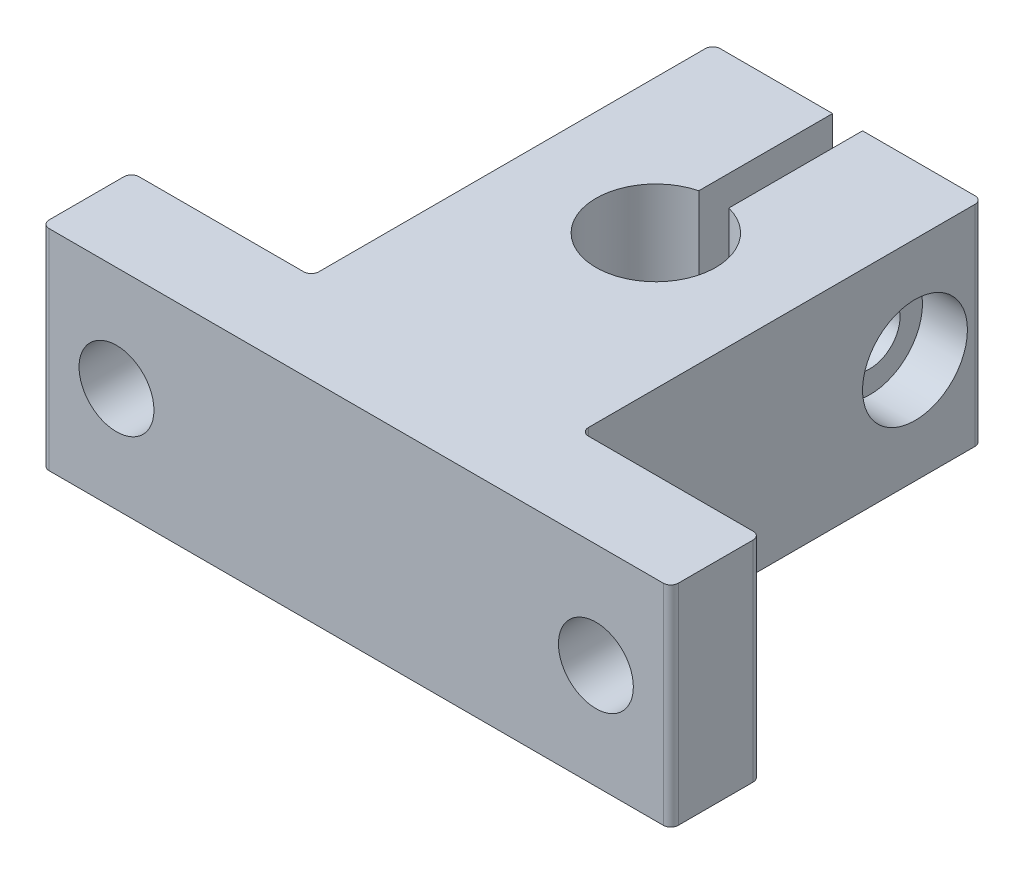
ISO-10303-21;
HEADER;
FILE_DESCRIPTION(('STEP AP214'),'2;1');
FILE_NAME('part.step','',(''),(''),'','','');
FILE_SCHEMA(('AUTOMOTIVE_DESIGN { 1 0 10303 214 1 1 1 1 }'));
ENDSEC;
DATA;
#1=APPLICATION_CONTEXT('core data for automotive mechanical design processes');
#2=APPLICATION_PROTOCOL_DEFINITION('international standard','automotive_design',2000,#1);
#3=PRODUCT_CONTEXT('',#1,'mechanical');
#4=PRODUCT('Part','Part','',(#3));
#5=PRODUCT_RELATED_PRODUCT_CATEGORY('part','',(#4));
#6=PRODUCT_DEFINITION_FORMATION('','',#4);
#7=PRODUCT_DEFINITION_CONTEXT('part definition',#1,'design');
#8=PRODUCT_DEFINITION('design','',#6,#7);
#9=PRODUCT_DEFINITION_SHAPE('','',#8);
#10=(LENGTH_UNIT() NAMED_UNIT(*) SI_UNIT(.MILLI.,.METRE.));
#11=(NAMED_UNIT(*) PLANE_ANGLE_UNIT() SI_UNIT($,.RADIAN.));
#12=(NAMED_UNIT(*) SI_UNIT($,.STERADIAN.) SOLID_ANGLE_UNIT());
#13=UNCERTAINTY_MEASURE_WITH_UNIT(LENGTH_MEASURE(1.E-05),#10,'distance_accuracy_value','');
#14=(GEOMETRIC_REPRESENTATION_CONTEXT(3) GLOBAL_UNCERTAINTY_ASSIGNED_CONTEXT((#13)) GLOBAL_UNIT_ASSIGNED_CONTEXT((#10,
#11,#12)) REPRESENTATION_CONTEXT('',''));
#15=CARTESIAN_POINT('',(0.,0.,0.));
#16=DIRECTION('',(0.,0.,1.));
#17=DIRECTION('',(1.,0.,0.));
#18=AXIS2_PLACEMENT_3D('',#15,#16,#17);
#19=CARTESIAN_POINT('',(-11.,7.,-8.3));
#20=DIRECTION('',(1.,0.,0.));
#21=DIRECTION('',(0.,0.,-1.));
#22=AXIS2_PLACEMENT_3D('',#19,#20,#21);
#23=CYLINDRICAL_SURFACE('',#22,2.);
#24=CARTESIAN_POINT('',(0.999999999999999,7.,-8.3));
#25=DIRECTION('',(1.,0.,0.));
#26=DIRECTION('',(0.,0.,-1.));
#27=AXIS2_PLACEMENT_3D('',#24,#25,#26);
#28=CIRCLE('',#27,2.);
#29=CARTESIAN_POINT('',(0.999999999999999,7.,-10.3));
#30=VERTEX_POINT('',#29);
#31=EDGE_CURVE('E225',#30,#30,#28,.T.);
#32=ORIENTED_EDGE('',*,*,#31,.F.);
#33=EDGE_LOOP('',(#32));
#34=FACE_BOUND('',#33,.T.);
#35=CARTESIAN_POINT('',(6.,7.,-8.3));
#36=DIRECTION('',(1.,0.,0.));
#37=DIRECTION('',(0.,0.,-1.));
#38=AXIS2_PLACEMENT_3D('',#35,#36,#37);
#39=CIRCLE('',#38,2.);
#40=CARTESIAN_POINT('',(6.,7.,-10.3));
#41=VERTEX_POINT('',#40);
#42=EDGE_CURVE('E263',#41,#41,#39,.F.);
#43=ORIENTED_EDGE('',*,*,#42,.F.);
#44=EDGE_LOOP('',(#43));
#45=FACE_BOUND('',#44,.T.);
#46=ADVANCED_FACE('F44',(#34,#45),#23,.F.);
#47=CARTESIAN_POINT('',(-21.,14.,14.));
#48=DIRECTION('',(1.,0.,0.));
#49=DIRECTION('',(0.,0.,-1.));
#50=AXIS2_PLACEMENT_3D('',#47,#48,#49);
#51=PLANE('',#50);
#52=DIRECTION('',(0.,0.,1.));
#53=VECTOR('',#52,1.);
#54=CARTESIAN_POINT('',(-21.,0.,14.));
#55=LINE('',#54,#53);
#56=CARTESIAN_POINT('',(-21.,0.,14.5));
#57=VERTEX_POINT('',#56);
#58=CARTESIAN_POINT('',(-21.,0.,19.5));
#59=VERTEX_POINT('',#58);
#60=EDGE_CURVE('E221',#57,#59,#55,.T.);
#61=ORIENTED_EDGE('',*,*,#60,.T.);
#62=DIRECTION('',(0.,-1.,0.));
#63=VECTOR('',#62,1.);
#64=CARTESIAN_POINT('',(-21.,14.,19.5));
#65=LINE('',#64,#63);
#66=CARTESIAN_POINT('',(-21.,14.,19.5));
#67=VERTEX_POINT('',#66);
#68=EDGE_CURVE('E334',#59,#67,#65,.F.);
#69=ORIENTED_EDGE('',*,*,#68,.T.);
#70=DIRECTION('',(0.,0.,1.));
#71=VECTOR('',#70,1.);
#72=CARTESIAN_POINT('',(-21.,14.,14.));
#73=LINE('',#72,#71);
#74=CARTESIAN_POINT('',(-21.,14.,14.5));
#75=VERTEX_POINT('',#74);
#76=EDGE_CURVE('E252',#75,#67,#73,.T.);
#77=ORIENTED_EDGE('',*,*,#76,.F.);
#78=DIRECTION('',(0.,-1.,0.));
#79=VECTOR('',#78,1.);
#80=CARTESIAN_POINT('',(-21.,14.,14.5));
#81=LINE('',#80,#79);
#82=EDGE_CURVE('E331',#75,#57,#81,.T.);
#83=ORIENTED_EDGE('',*,*,#82,.T.);
#84=EDGE_LOOP('',(#61,#69,#77,#83));
#85=FACE_BOUND('',#84,.T.);
#86=ADVANCED_FACE('F363',(#85),#51,.F.);
#87=CARTESIAN_POINT('',(-21.,14.,20.));
#88=DIRECTION('',(0.,0.,-1.));
#89=DIRECTION('',(-1.,0.,0.));
#90=AXIS2_PLACEMENT_3D('',#87,#88,#89);
#91=PLANE('',#90);
#92=CARTESIAN_POINT('',(16.,7.00000000000001,20.));
#93=DIRECTION('',(0.,0.,1.));
#94=DIRECTION('',(1.,0.,0.));
#95=AXIS2_PLACEMENT_3D('',#92,#93,#94);
#96=CIRCLE('',#95,2.5);
#97=CARTESIAN_POINT('',(18.5,7.00000000000001,20.));
#98=VERTEX_POINT('',#97);
#99=EDGE_CURVE('E275',#98,#98,#96,.T.);
#100=ORIENTED_EDGE('',*,*,#99,.F.);
#101=EDGE_LOOP('',(#100));
#102=FACE_BOUND('',#101,.T.);
#103=CARTESIAN_POINT('',(-16.,7.,20.));
#104=DIRECTION('',(0.,0.,1.));
#105=DIRECTION('',(1.,0.,0.));
#106=AXIS2_PLACEMENT_3D('',#103,#104,#105);
#107=CIRCLE('',#106,2.5);
#108=CARTESIAN_POINT('',(-13.5,7.,20.));
#109=VERTEX_POINT('',#108);
#110=EDGE_CURVE('E271',#109,#109,#107,.T.);
#111=ORIENTED_EDGE('',*,*,#110,.F.);
#112=EDGE_LOOP('',(#111));
#113=FACE_BOUND('',#112,.T.);
#114=DIRECTION('',(1.,0.,0.));
#115=VECTOR('',#114,1.);
#116=CARTESIAN_POINT('',(-21.,0.,20.));
#117=LINE('',#116,#115);
#118=CARTESIAN_POINT('',(-20.5,0.,20.));
#119=VERTEX_POINT('',#118);
#120=CARTESIAN_POINT('',(20.5,0.,20.));
#121=VERTEX_POINT('',#120);
#122=EDGE_CURVE('E224',#119,#121,#117,.T.);
#123=ORIENTED_EDGE('',*,*,#122,.T.);
#124=DIRECTION('',(0.,-1.,0.));
#125=VECTOR('',#124,1.);
#126=CARTESIAN_POINT('',(20.5,14.,20.));
#127=LINE('',#126,#125);
#128=CARTESIAN_POINT('',(20.5,14.,20.));
#129=VERTEX_POINT('',#128);
#130=EDGE_CURVE('E329',#121,#129,#127,.F.);
#131=ORIENTED_EDGE('',*,*,#130,.T.);
#132=DIRECTION('',(1.,0.,0.));
#133=VECTOR('',#132,1.);
#134=CARTESIAN_POINT('',(-21.,14.,20.));
#135=LINE('',#134,#133);
#136=CARTESIAN_POINT('',(-20.5,14.,20.));
#137=VERTEX_POINT('',#136);
#138=EDGE_CURVE('E366',#137,#129,#135,.T.);
#139=ORIENTED_EDGE('',*,*,#138,.F.);
#140=DIRECTION('',(0.,-1.,0.));
#141=VECTOR('',#140,1.);
#142=CARTESIAN_POINT('',(-20.5,14.,20.));
#143=LINE('',#142,#141);
#144=EDGE_CURVE('E326',#137,#119,#143,.T.);
#145=ORIENTED_EDGE('',*,*,#144,.T.);
#146=EDGE_LOOP('',(#123,#131,#139,#145));
#147=FACE_BOUND('',#146,.T.);
#148=ADVANCED_FACE('F419',(#102,#113,#147),#91,.F.);
#149=CARTESIAN_POINT('',(21.,14.,14.));
#150=DIRECTION('',(-1.,0.,0.));
#151=DIRECTION('',(0.,0.,1.));
#152=AXIS2_PLACEMENT_3D('',#149,#150,#151);
#153=PLANE('',#152);
#154=DIRECTION('',(0.,0.,-1.));
#155=VECTOR('',#154,1.);
#156=CARTESIAN_POINT('',(21.,0.,14.));
#157=LINE('',#156,#155);
#158=CARTESIAN_POINT('',(21.,0.,19.5));
#159=VERTEX_POINT('',#158);
#160=CARTESIAN_POINT('',(21.,0.,14.5));
#161=VERTEX_POINT('',#160);
#162=EDGE_CURVE('E228',#159,#161,#157,.T.);
#163=ORIENTED_EDGE('',*,*,#162,.T.);
#164=DIRECTION('',(0.,-1.,0.));
#165=VECTOR('',#164,1.);
#166=CARTESIAN_POINT('',(21.,14.,14.5));
#167=LINE('',#166,#165);
#168=CARTESIAN_POINT('',(21.,14.,14.5));
#169=VERTEX_POINT('',#168);
#170=EDGE_CURVE('E67',#161,#169,#167,.F.);
#171=ORIENTED_EDGE('',*,*,#170,.T.);
#172=DIRECTION('',(0.,0.,-1.));
#173=VECTOR('',#172,1.);
#174=CARTESIAN_POINT('',(21.,14.,14.));
#175=LINE('',#174,#173);
#176=CARTESIAN_POINT('',(21.,14.,19.5));
#177=VERTEX_POINT('',#176);
#178=EDGE_CURVE('E369',#177,#169,#175,.T.);
#179=ORIENTED_EDGE('',*,*,#178,.F.);
#180=DIRECTION('',(0.,-1.,0.));
#181=VECTOR('',#180,1.);
#182=CARTESIAN_POINT('',(21.,14.,19.5));
#183=LINE('',#182,#181);
#184=EDGE_CURVE('E322',#177,#159,#183,.T.);
#185=ORIENTED_EDGE('',*,*,#184,.T.);
#186=EDGE_LOOP('',(#163,#171,#179,#185));
#187=FACE_BOUND('',#186,.T.);
#188=ADVANCED_FACE('F457',(#187),#153,.F.);
#189=CARTESIAN_POINT('',(9.,14.,14.));
#190=DIRECTION('',(0.,0.,1.));
#191=DIRECTION('',(1.,0.,0.));
#192=AXIS2_PLACEMENT_3D('',#189,#190,#191);
#193=PLANE('',#192);
#194=CARTESIAN_POINT('',(16.,7.00000000000001,14.));
#195=DIRECTION('',(0.,0.,1.));
#196=DIRECTION('',(1.,0.,0.));
#197=AXIS2_PLACEMENT_3D('',#194,#195,#196);
#198=CIRCLE('',#197,2.5);
#199=CARTESIAN_POINT('',(18.5,7.00000000000001,14.));
#200=VERTEX_POINT('',#199);
#201=EDGE_CURVE('E272',#200,#200,#198,.T.);
#202=ORIENTED_EDGE('',*,*,#201,.T.);
#203=EDGE_LOOP('',(#202));
#204=FACE_BOUND('',#203,.T.);
#205=DIRECTION('',(-1.,0.,0.));
#206=VECTOR('',#205,1.);
#207=CARTESIAN_POINT('',(9.,0.,14.));
#208=LINE('',#207,#206);
#209=CARTESIAN_POINT('',(20.5,0.,14.));
#210=VERTEX_POINT('',#209);
#211=CARTESIAN_POINT('',(9.5,0.,14.));
#212=VERTEX_POINT('',#211);
#213=EDGE_CURVE('E230',#210,#212,#208,.T.);
#214=ORIENTED_EDGE('',*,*,#213,.T.);
#215=DIRECTION('',(0.,-1.,0.));
#216=VECTOR('',#215,1.);
#217=CARTESIAN_POINT('',(9.5,14.,14.));
#218=LINE('',#217,#216);
#219=CARTESIAN_POINT('',(9.5,14.,14.));
#220=VERTEX_POINT('',#219);
#221=EDGE_CURVE('E283',#212,#220,#218,.F.);
#222=ORIENTED_EDGE('',*,*,#221,.T.);
#223=DIRECTION('',(-1.,0.,0.));
#224=VECTOR('',#223,1.);
#225=CARTESIAN_POINT('',(9.,14.,14.));
#226=LINE('',#225,#224);
#227=CARTESIAN_POINT('',(20.5,14.,14.));
#228=VERTEX_POINT('',#227);
#229=EDGE_CURVE('E375',#228,#220,#226,.T.);
#230=ORIENTED_EDGE('',*,*,#229,.F.);
#231=DIRECTION('',(0.,-1.,0.));
#232=VECTOR('',#231,1.);
#233=CARTESIAN_POINT('',(20.5,14.,14.));
#234=LINE('',#233,#232);
#235=EDGE_CURVE('E280',#228,#210,#234,.T.);
#236=ORIENTED_EDGE('',*,*,#235,.T.);
#237=EDGE_LOOP('',(#214,#222,#230,#236));
#238=FACE_BOUND('',#237,.T.);
#239=ADVANCED_FACE('F476',(#204,#238),#193,.F.);
#240=CARTESIAN_POINT('',(9.,14.,14.));
#241=DIRECTION('',(-1.,0.,0.));
#242=DIRECTION('',(0.,0.,1.));
#243=AXIS2_PLACEMENT_3D('',#240,#241,#242);
#244=PLANE('',#243);
#245=CARTESIAN_POINT('',(9.,7.,-8.3));
#246=DIRECTION('',(1.,0.,0.));
#247=DIRECTION('',(0.,0.,-1.));
#248=AXIS2_PLACEMENT_3D('',#245,#246,#247);
#249=CIRCLE('',#248,3.5);
#250=CARTESIAN_POINT('',(9.,7.,-11.8));
#251=VERTEX_POINT('',#250);
#252=EDGE_CURVE('E270',#251,#251,#249,.T.);
#253=ORIENTED_EDGE('',*,*,#252,.F.);
#254=EDGE_LOOP('',(#253));
#255=FACE_BOUND('',#254,.T.);
#256=DIRECTION('',(0.,0.,-1.));
#257=VECTOR('',#256,1.);
#258=CARTESIAN_POINT('',(9.,14.,14.));
#259=LINE('',#258,#257);
#260=CARTESIAN_POINT('',(9.,14.,13.5));
#261=VERTEX_POINT('',#260);
#262=CARTESIAN_POINT('',(9.,14.,-12.3));
#263=VERTEX_POINT('',#262);
#264=EDGE_CURVE('E190',#261,#263,#259,.T.);
#265=ORIENTED_EDGE('',*,*,#264,.F.);
#266=DIRECTION('',(0.,-1.,0.));
#267=VECTOR('',#266,1.);
#268=CARTESIAN_POINT('',(9.,0.,13.5));
#269=LINE('',#268,#267);
#270=CARTESIAN_POINT('',(9.,0.,13.5));
#271=VERTEX_POINT('',#270);
#272=EDGE_CURVE('E277',#261,#271,#269,.T.);
#273=ORIENTED_EDGE('',*,*,#272,.T.);
#274=DIRECTION('',(0.,0.,-1.));
#275=VECTOR('',#274,1.);
#276=CARTESIAN_POINT('',(9.,0.,14.));
#277=LINE('',#276,#275);
#278=CARTESIAN_POINT('',(9.,0.,-12.3));
#279=VERTEX_POINT('',#278);
#280=EDGE_CURVE('E233',#271,#279,#277,.T.);
#281=ORIENTED_EDGE('',*,*,#280,.T.);
#282=DIRECTION('',(0.,-1.,0.));
#283=VECTOR('',#282,1.);
#284=CARTESIAN_POINT('',(9.,14.,-12.3));
#285=LINE('',#284,#283);
#286=EDGE_CURVE('E199',#279,#263,#285,.F.);
#287=ORIENTED_EDGE('',*,*,#286,.T.);
#288=EDGE_LOOP('',(#265,#273,#281,#287));
#289=FACE_BOUND('',#288,.T.);
#290=ADVANCED_FACE('F479',(#255,#289),#244,.F.);
#291=CARTESIAN_POINT('',(0.999999999999999,14.,-12.8));
#292=DIRECTION('',(0.,0.,1.));
#293=DIRECTION('',(1.,0.,0.));
#294=AXIS2_PLACEMENT_3D('',#291,#292,#293);
#295=PLANE('',#294);
#296=DIRECTION('',(-1.,0.,0.));
#297=VECTOR('',#296,1.);
#298=CARTESIAN_POINT('',(0.999999999999999,14.,-12.8));
#299=LINE('',#298,#297);
#300=CARTESIAN_POINT('',(8.5,14.,-12.8));
#301=VERTEX_POINT('',#300);
#302=CARTESIAN_POINT('',(0.999999999999999,14.,-12.8));
#303=VERTEX_POINT('',#302);
#304=EDGE_CURVE('E180',#301,#303,#299,.T.);
#305=ORIENTED_EDGE('',*,*,#304,.F.);
#306=DIRECTION('',(0.,-1.,0.));
#307=VECTOR('',#306,1.);
#308=CARTESIAN_POINT('',(8.5,14.,-12.8));
#309=LINE('',#308,#307);
#310=CARTESIAN_POINT('',(8.5,0.,-12.8));
#311=VERTEX_POINT('',#310);
#312=EDGE_CURVE('E320',#301,#311,#309,.T.);
#313=ORIENTED_EDGE('',*,*,#312,.T.);
#314=DIRECTION('',(-1.,0.,0.));
#315=VECTOR('',#314,1.);
#316=CARTESIAN_POINT('',(0.999999999999999,0.,-12.8));
#317=LINE('',#316,#315);
#318=CARTESIAN_POINT('',(0.999999999999999,0.,-12.8));
#319=VERTEX_POINT('',#318);
#320=EDGE_CURVE('E196',#311,#319,#317,.T.);
#321=ORIENTED_EDGE('',*,*,#320,.T.);
#322=DIRECTION('',(0.,-1.,0.));
#323=VECTOR('',#322,1.);
#324=CARTESIAN_POINT('',(0.999999999999999,14.,-12.8));
#325=LINE('',#324,#323);
#326=EDGE_CURVE('E193',#303,#319,#325,.T.);
#327=ORIENTED_EDGE('',*,*,#326,.F.);
#328=EDGE_LOOP('',(#305,#313,#321,#327));
#329=FACE_BOUND('',#328,.T.);
#330=ADVANCED_FACE('F194',(#329),#295,.F.);
#331=CARTESIAN_POINT('',(0.999999999999999,14.,-12.8));
#332=DIRECTION('',(1.,0.,0.));
#333=DIRECTION('',(0.,0.,-1.));
#334=AXIS2_PLACEMENT_3D('',#331,#332,#333);
#335=PLANE('',#334);
#336=ORIENTED_EDGE('',*,*,#31,.T.);
#337=EDGE_LOOP('',(#336));
#338=FACE_BOUND('',#337,.T.);
#339=DIRECTION('',(0.,0.,1.));
#340=VECTOR('',#339,1.);
#341=CARTESIAN_POINT('',(0.999999999999999,0.,-12.8));
#342=LINE('',#341,#340);
#343=CARTESIAN_POINT('',(0.999999999999998,0.,-3.87298334620742));
#344=VERTEX_POINT('',#343);
#345=EDGE_CURVE('E237',#319,#344,#342,.T.);
#346=ORIENTED_EDGE('',*,*,#345,.T.);
#347=DIRECTION('',(0.,-1.,0.));
#348=VECTOR('',#347,1.);
#349=CARTESIAN_POINT('',(0.999999999999998,14.,-3.87298334620742));
#350=LINE('',#349,#348);
#351=CARTESIAN_POINT('',(0.999999999999998,14.,-3.87298334620742));
#352=VERTEX_POINT('',#351);
#353=EDGE_CURVE('E200',#352,#344,#350,.T.);
#354=ORIENTED_EDGE('',*,*,#353,.F.);
#355=DIRECTION('',(0.,0.,1.));
#356=VECTOR('',#355,1.);
#357=CARTESIAN_POINT('',(0.999999999999999,14.,-12.8));
#358=LINE('',#357,#356);
#359=EDGE_CURVE('E185',#303,#352,#358,.T.);
#360=ORIENTED_EDGE('',*,*,#359,.F.);
#361=ORIENTED_EDGE('',*,*,#326,.T.);
#362=EDGE_LOOP('',(#346,#354,#360,#361));
#363=FACE_BOUND('',#362,.T.);
#364=ADVANCED_FACE('F202',(#338,#363),#335,.F.);
#365=CARTESIAN_POINT('',(0.,14.,0.));
#366=DIRECTION('',(0.,-1.,0.));
#367=DIRECTION('',(0.,0.,-1.));
#368=AXIS2_PLACEMENT_3D('',#365,#366,#367);
#369=CYLINDRICAL_SURFACE('',#368,4.);
#370=CARTESIAN_POINT('',(0.,0.,0.));
#371=DIRECTION('',(0.,-1.,0.));
#372=DIRECTION('',(0.,0.,1.));
#373=AXIS2_PLACEMENT_3D('',#370,#371,#372);
#374=CIRCLE('',#373,4.);
#375=CARTESIAN_POINT('',(-0.999999999999999,0.,-3.87298334620742));
#376=VERTEX_POINT('',#375);
#377=EDGE_CURVE('E239',#344,#376,#374,.T.);
#378=ORIENTED_EDGE('',*,*,#377,.T.);
#379=DIRECTION('',(0.,-1.,0.));
#380=VECTOR('',#379,1.);
#381=CARTESIAN_POINT('',(-0.999999999999999,14.,-3.87298334620742));
#382=LINE('',#381,#380);
#383=CARTESIAN_POINT('',(-0.999999999999999,14.,-3.87298334620742));
#384=VERTEX_POINT('',#383);
#385=EDGE_CURVE('E255',#384,#376,#382,.T.);
#386=ORIENTED_EDGE('',*,*,#385,.F.);
#387=CARTESIAN_POINT('',(0.,14.,0.));
#388=DIRECTION('',(0.,-1.,0.));
#389=DIRECTION('',(0.,0.,1.));
#390=AXIS2_PLACEMENT_3D('',#387,#388,#389);
#391=CIRCLE('',#390,4.);
#392=EDGE_CURVE('E205',#352,#384,#391,.T.);
#393=ORIENTED_EDGE('',*,*,#392,.F.);
#394=ORIENTED_EDGE('',*,*,#353,.T.);
#395=EDGE_LOOP('',(#378,#386,#393,#394));
#396=FACE_BOUND('',#395,.T.);
#397=ADVANCED_FACE('F388',(#396),#369,.F.);
#398=CARTESIAN_POINT('',(-0.999999999999999,14.,-12.8));
#399=DIRECTION('',(-1.,0.,0.));
#400=DIRECTION('',(0.,0.,1.));
#401=AXIS2_PLACEMENT_3D('',#398,#399,#400);
#402=PLANE('',#401);
#403=CARTESIAN_POINT('',(-0.999999999999999,7.,-8.3));
#404=DIRECTION('',(-1.,0.,0.));
#405=DIRECTION('',(0.,0.,1.));
#406=AXIS2_PLACEMENT_3D('',#403,#404,#405);
#407=CIRCLE('',#406,2.);
#408=CARTESIAN_POINT('',(-0.999999999999999,7.,-6.29999999999999));
#409=VERTEX_POINT('',#408);
#410=EDGE_CURVE('E262',#409,#409,#407,.T.);
#411=ORIENTED_EDGE('',*,*,#410,.T.);
#412=EDGE_LOOP('',(#411));
#413=FACE_BOUND('',#412,.T.);
#414=DIRECTION('',(0.,0.,-1.));
#415=VECTOR('',#414,1.);
#416=CARTESIAN_POINT('',(-0.999999999999999,0.,-12.8));
#417=LINE('',#416,#415);
#418=CARTESIAN_POINT('',(-0.999999999999999,0.,-12.8));
#419=VERTEX_POINT('',#418);
#420=EDGE_CURVE('E241',#376,#419,#417,.T.);
#421=ORIENTED_EDGE('',*,*,#420,.T.);
#422=DIRECTION('',(0.,-1.,0.));
#423=VECTOR('',#422,1.);
#424=CARTESIAN_POINT('',(-0.999999999999999,14.,-12.8));
#425=LINE('',#424,#423);
#426=CARTESIAN_POINT('',(-0.999999999999999,14.,-12.8));
#427=VERTEX_POINT('',#426);
#428=EDGE_CURVE('E220',#427,#419,#425,.T.);
#429=ORIENTED_EDGE('',*,*,#428,.F.);
#430=DIRECTION('',(0.,0.,-1.));
#431=VECTOR('',#430,1.);
#432=CARTESIAN_POINT('',(-0.999999999999999,14.,-12.8));
#433=LINE('',#432,#431);
#434=EDGE_CURVE('E207',#384,#427,#433,.T.);
#435=ORIENTED_EDGE('',*,*,#434,.F.);
#436=ORIENTED_EDGE('',*,*,#385,.T.);
#437=EDGE_LOOP('',(#421,#429,#435,#436));
#438=FACE_BOUND('',#437,.T.);
#439=ADVANCED_FACE('F395',(#413,#438),#402,.F.);
#440=CARTESIAN_POINT('',(-9.,14.,-12.8));
#441=DIRECTION('',(0.,0.,1.));
#442=DIRECTION('',(1.,0.,0.));
#443=AXIS2_PLACEMENT_3D('',#440,#441,#442);
#444=PLANE('',#443);
#445=DIRECTION('',(-1.,0.,0.));
#446=VECTOR('',#445,1.);
#447=CARTESIAN_POINT('',(-9.,0.,-12.8));
#448=LINE('',#447,#446);
#449=CARTESIAN_POINT('',(-8.5,0.,-12.8));
#450=VERTEX_POINT('',#449);
#451=EDGE_CURVE('E243',#419,#450,#448,.T.);
#452=ORIENTED_EDGE('',*,*,#451,.T.);
#453=DIRECTION('',(0.,-1.,0.));
#454=VECTOR('',#453,1.);
#455=CARTESIAN_POINT('',(-8.5,14.,-12.8));
#456=LINE('',#455,#454);
#457=CARTESIAN_POINT('',(-8.5,14.,-12.8));
#458=VERTEX_POINT('',#457);
#459=EDGE_CURVE('E307',#450,#458,#456,.F.);
#460=ORIENTED_EDGE('',*,*,#459,.T.);
#461=DIRECTION('',(-1.,0.,0.));
#462=VECTOR('',#461,1.);
#463=CARTESIAN_POINT('',(-9.,14.,-12.8));
#464=LINE('',#463,#462);
#465=EDGE_CURVE('E212',#427,#458,#464,.T.);
#466=ORIENTED_EDGE('',*,*,#465,.F.);
#467=ORIENTED_EDGE('',*,*,#428,.T.);
#468=EDGE_LOOP('',(#452,#460,#466,#467));
#469=FACE_BOUND('',#468,.T.);
#470=ADVANCED_FACE('F398',(#469),#444,.F.);
#471=CARTESIAN_POINT('',(-9.,14.,14.));
#472=DIRECTION('',(1.,0.,0.));
#473=DIRECTION('',(0.,0.,-1.));
#474=AXIS2_PLACEMENT_3D('',#471,#472,#473);
#475=PLANE('',#474);
#476=CARTESIAN_POINT('',(-9.,7.,-8.3));
#477=DIRECTION('',(1.,0.,0.));
#478=DIRECTION('',(0.,0.,-1.));
#479=AXIS2_PLACEMENT_3D('',#476,#477,#478);
#480=CIRCLE('',#479,2.);
#481=CARTESIAN_POINT('',(-9.,7.,-10.3));
#482=VERTEX_POINT('',#481);
#483=EDGE_CURVE('E259',#482,#482,#480,.T.);
#484=ORIENTED_EDGE('',*,*,#483,.T.);
#485=EDGE_LOOP('',(#484));
#486=FACE_BOUND('',#485,.T.);
#487=DIRECTION('',(0.,0.,1.));
#488=VECTOR('',#487,1.);
#489=CARTESIAN_POINT('',(-9.,0.,14.));
#490=LINE('',#489,#488);
#491=CARTESIAN_POINT('',(-9.,0.,-12.3));
#492=VERTEX_POINT('',#491);
#493=CARTESIAN_POINT('',(-9.,0.,13.5));
#494=VERTEX_POINT('',#493);
#495=EDGE_CURVE('E246',#492,#494,#490,.T.);
#496=ORIENTED_EDGE('',*,*,#495,.T.);
#497=DIRECTION('',(0.,-1.,0.));
#498=VECTOR('',#497,1.);
#499=CARTESIAN_POINT('',(-9.,14.,13.5));
#500=LINE('',#499,#498);
#501=CARTESIAN_POINT('',(-9.,14.,13.5));
#502=VERTEX_POINT('',#501);
#503=EDGE_CURVE('E293',#494,#502,#500,.F.);
#504=ORIENTED_EDGE('',*,*,#503,.T.);
#505=DIRECTION('',(0.,0.,1.));
#506=VECTOR('',#505,1.);
#507=CARTESIAN_POINT('',(-9.,14.,14.));
#508=LINE('',#507,#506);
#509=CARTESIAN_POINT('',(-9.,14.,-12.3));
#510=VERTEX_POINT('',#509);
#511=EDGE_CURVE('E214',#510,#502,#508,.T.);
#512=ORIENTED_EDGE('',*,*,#511,.F.);
#513=DIRECTION('',(0.,-1.,0.));
#514=VECTOR('',#513,1.);
#515=CARTESIAN_POINT('',(-9.,14.,-12.3));
#516=LINE('',#515,#514);
#517=EDGE_CURVE('E290',#510,#492,#516,.T.);
#518=ORIENTED_EDGE('',*,*,#517,.T.);
#519=EDGE_LOOP('',(#496,#504,#512,#518));
#520=FACE_BOUND('',#519,.T.);
#521=ADVANCED_FACE('F347',(#486,#520),#475,.F.);
#522=CARTESIAN_POINT('',(-21.,14.,14.));
#523=DIRECTION('',(0.,0.,1.));
#524=DIRECTION('',(1.,0.,0.));
#525=AXIS2_PLACEMENT_3D('',#522,#523,#524);
#526=PLANE('',#525);
#527=CARTESIAN_POINT('',(-16.,7.,14.));
#528=DIRECTION('',(0.,0.,1.));
#529=DIRECTION('',(1.,0.,0.));
#530=AXIS2_PLACEMENT_3D('',#527,#528,#529);
#531=CIRCLE('',#530,2.5);
#532=CARTESIAN_POINT('',(-13.5,7.,14.));
#533=VERTEX_POINT('',#532);
#534=EDGE_CURVE('E267',#533,#533,#531,.T.);
#535=ORIENTED_EDGE('',*,*,#534,.T.);
#536=EDGE_LOOP('',(#535));
#537=FACE_BOUND('',#536,.T.);
#538=DIRECTION('',(-1.,0.,0.));
#539=VECTOR('',#538,1.);
#540=CARTESIAN_POINT('',(-21.,14.,14.));
#541=LINE('',#540,#539);
#542=CARTESIAN_POINT('',(-9.5,14.,14.));
#543=VERTEX_POINT('',#542);
#544=CARTESIAN_POINT('',(-20.5,14.,14.));
#545=VERTEX_POINT('',#544);
#546=EDGE_CURVE('E217',#543,#545,#541,.T.);
#547=ORIENTED_EDGE('',*,*,#546,.F.);
#548=DIRECTION('',(0.,-1.,0.));
#549=VECTOR('',#548,1.);
#550=CARTESIAN_POINT('',(-9.5,0.,14.));
#551=LINE('',#550,#549);
#552=CARTESIAN_POINT('',(-9.5,0.,14.));
#553=VERTEX_POINT('',#552);
#554=EDGE_CURVE('E287',#543,#553,#551,.T.);
#555=ORIENTED_EDGE('',*,*,#554,.T.);
#556=DIRECTION('',(-1.,0.,0.));
#557=VECTOR('',#556,1.);
#558=CARTESIAN_POINT('',(-21.,0.,14.));
#559=LINE('',#558,#557);
#560=CARTESIAN_POINT('',(-20.5,0.,14.));
#561=VERTEX_POINT('',#560);
#562=EDGE_CURVE('E249',#553,#561,#559,.T.);
#563=ORIENTED_EDGE('',*,*,#562,.T.);
#564=DIRECTION('',(0.,-1.,0.));
#565=VECTOR('',#564,1.);
#566=CARTESIAN_POINT('',(-20.5,14.,14.));
#567=LINE('',#566,#565);
#568=EDGE_CURVE('E285',#561,#545,#567,.F.);
#569=ORIENTED_EDGE('',*,*,#568,.T.);
#570=EDGE_LOOP('',(#547,#555,#563,#569));
#571=FACE_BOUND('',#570,.T.);
#572=ADVANCED_FACE('F355',(#537,#571),#526,.F.);
#573=CARTESIAN_POINT('',(0.,14.,0.));
#574=DIRECTION('',(0.,1.,0.));
#575=DIRECTION('',(0.,0.,1.));
#576=AXIS2_PLACEMENT_3D('',#573,#574,#575);
#577=PLANE('',#576);
#578=ORIENTED_EDGE('',*,*,#465,.T.);
#579=CARTESIAN_POINT('',(-8.5,14.,-12.3));
#580=DIRECTION('',(0.,1.,0.));
#581=DIRECTION('',(0.,0.,1.));
#582=AXIS2_PLACEMENT_3D('',#579,#580,#581);
#583=CIRCLE('',#582,0.5);
#584=EDGE_CURVE('E318',#458,#510,#583,.T.);
#585=ORIENTED_EDGE('',*,*,#584,.T.);
#586=ORIENTED_EDGE('',*,*,#511,.T.);
#587=CARTESIAN_POINT('',(-9.5,14.,13.5));
#588=DIRECTION('',(0.,1.,0.));
#589=DIRECTION('',(0.,0.,1.));
#590=AXIS2_PLACEMENT_3D('',#587,#588,#589);
#591=CIRCLE('',#590,0.5);
#592=EDGE_CURVE('E13',#502,#543,#591,.F.);
#593=ORIENTED_EDGE('',*,*,#592,.T.);
#594=ORIENTED_EDGE('',*,*,#546,.T.);
#595=CARTESIAN_POINT('',(-20.5,14.,14.5));
#596=DIRECTION('',(0.,1.,0.));
#597=DIRECTION('',(0.,0.,1.));
#598=AXIS2_PLACEMENT_3D('',#595,#596,#597);
#599=CIRCLE('',#598,0.5);
#600=EDGE_CURVE('E309',#545,#75,#599,.T.);
#601=ORIENTED_EDGE('',*,*,#600,.T.);
#602=ORIENTED_EDGE('',*,*,#76,.T.);
#603=CARTESIAN_POINT('',(-20.5,14.,19.5));
#604=DIRECTION('',(0.,1.,0.));
#605=DIRECTION('',(0.,0.,1.));
#606=AXIS2_PLACEMENT_3D('',#603,#604,#605);
#607=CIRCLE('',#606,0.5);
#608=EDGE_CURVE('E311',#67,#137,#607,.T.);
#609=ORIENTED_EDGE('',*,*,#608,.T.);
#610=ORIENTED_EDGE('',*,*,#138,.T.);
#611=CARTESIAN_POINT('',(20.5,14.,19.5));
#612=DIRECTION('',(0.,1.,0.));
#613=DIRECTION('',(0.,0.,1.));
#614=AXIS2_PLACEMENT_3D('',#611,#612,#613);
#615=CIRCLE('',#614,0.5);
#616=EDGE_CURVE('E313',#129,#177,#615,.T.);
#617=ORIENTED_EDGE('',*,*,#616,.T.);
#618=ORIENTED_EDGE('',*,*,#178,.T.);
#619=CARTESIAN_POINT('',(20.5,14.,14.5));
#620=DIRECTION('',(0.,1.,0.));
#621=DIRECTION('',(0.,0.,1.));
#622=AXIS2_PLACEMENT_3D('',#619,#620,#621);
#623=CIRCLE('',#622,0.5);
#624=EDGE_CURVE('E315',#169,#228,#623,.T.);
#625=ORIENTED_EDGE('',*,*,#624,.T.);
#626=ORIENTED_EDGE('',*,*,#229,.T.);
#627=CARTESIAN_POINT('',(9.5,14.,13.5));
#628=DIRECTION('',(0.,1.,0.));
#629=DIRECTION('',(0.,0.,1.));
#630=AXIS2_PLACEMENT_3D('',#627,#628,#629);
#631=CIRCLE('',#630,0.5);
#632=EDGE_CURVE('E338',#220,#261,#631,.F.);
#633=ORIENTED_EDGE('',*,*,#632,.T.);
#634=ORIENTED_EDGE('',*,*,#264,.T.);
#635=CARTESIAN_POINT('',(8.5,14.,-12.3));
#636=DIRECTION('',(0.,1.,0.));
#637=DIRECTION('',(0.,0.,1.));
#638=AXIS2_PLACEMENT_3D('',#635,#636,#637);
#639=CIRCLE('',#638,0.5);
#640=EDGE_CURVE('E59',#263,#301,#639,.T.);
#641=ORIENTED_EDGE('',*,*,#640,.T.);
#642=ORIENTED_EDGE('',*,*,#304,.T.);
#643=ORIENTED_EDGE('',*,*,#359,.T.);
#644=ORIENTED_EDGE('',*,*,#392,.T.);
#645=ORIENTED_EDGE('',*,*,#434,.T.);
#646=EDGE_LOOP('',(#578,#585,#586,#593,#594,#601,#602,#609,#610,#617,#618,#625,#626,#633,#634,
#641,#642,#643,#644,#645));
#647=FACE_BOUND('',#646,.T.);
#648=ADVANCED_FACE('F183',(#647),#577,.T.);
#649=CARTESIAN_POINT('',(0.,0.,0.));
#650=DIRECTION('',(0.,1.,0.));
#651=DIRECTION('',(0.,0.,1.));
#652=AXIS2_PLACEMENT_3D('',#649,#650,#651);
#653=PLANE('',#652);
#654=ORIENTED_EDGE('',*,*,#495,.F.);
#655=CARTESIAN_POINT('',(-8.5,0.,-12.3));
#656=DIRECTION('',(0.,1.,0.));
#657=DIRECTION('',(0.,0.,1.));
#658=AXIS2_PLACEMENT_3D('',#655,#656,#657);
#659=CIRCLE('',#658,0.5);
#660=EDGE_CURVE('E305',#492,#450,#659,.F.);
#661=ORIENTED_EDGE('',*,*,#660,.T.);
#662=ORIENTED_EDGE('',*,*,#451,.F.);
#663=ORIENTED_EDGE('',*,*,#420,.F.);
#664=ORIENTED_EDGE('',*,*,#377,.F.);
#665=ORIENTED_EDGE('',*,*,#345,.F.);
#666=ORIENTED_EDGE('',*,*,#320,.F.);
#667=CARTESIAN_POINT('',(8.5,0.,-12.3));
#668=DIRECTION('',(0.,1.,0.));
#669=DIRECTION('',(0.,0.,1.));
#670=AXIS2_PLACEMENT_3D('',#667,#668,#669);
#671=CIRCLE('',#670,0.5);
#672=EDGE_CURVE('E303',#311,#279,#671,.F.);
#673=ORIENTED_EDGE('',*,*,#672,.T.);
#674=ORIENTED_EDGE('',*,*,#280,.F.);
#675=CARTESIAN_POINT('',(9.5,0.,13.5));
#676=DIRECTION('',(0.,1.,0.));
#677=DIRECTION('',(0.,0.,1.));
#678=AXIS2_PLACEMENT_3D('',#675,#676,#677);
#679=CIRCLE('',#678,0.5);
#680=EDGE_CURVE('E336',#271,#212,#679,.T.);
#681=ORIENTED_EDGE('',*,*,#680,.T.);
#682=ORIENTED_EDGE('',*,*,#213,.F.);
#683=CARTESIAN_POINT('',(20.5,0.,14.5));
#684=DIRECTION('',(0.,1.,0.));
#685=DIRECTION('',(0.,0.,1.));
#686=AXIS2_PLACEMENT_3D('',#683,#684,#685);
#687=CIRCLE('',#686,0.5);
#688=EDGE_CURVE('E301',#210,#161,#687,.F.);
#689=ORIENTED_EDGE('',*,*,#688,.T.);
#690=ORIENTED_EDGE('',*,*,#162,.F.);
#691=CARTESIAN_POINT('',(20.5,0.,19.5));
#692=DIRECTION('',(0.,1.,0.));
#693=DIRECTION('',(0.,0.,1.));
#694=AXIS2_PLACEMENT_3D('',#691,#692,#693);
#695=CIRCLE('',#694,0.5);
#696=EDGE_CURVE('E299',#159,#121,#695,.F.);
#697=ORIENTED_EDGE('',*,*,#696,.T.);
#698=ORIENTED_EDGE('',*,*,#122,.F.);
#699=CARTESIAN_POINT('',(-20.5,0.,19.5));
#700=DIRECTION('',(0.,1.,0.));
#701=DIRECTION('',(0.,0.,1.));
#702=AXIS2_PLACEMENT_3D('',#699,#700,#701);
#703=CIRCLE('',#702,0.5);
#704=EDGE_CURVE('E297',#119,#59,#703,.F.);
#705=ORIENTED_EDGE('',*,*,#704,.T.);
#706=ORIENTED_EDGE('',*,*,#60,.F.);
#707=CARTESIAN_POINT('',(-20.5,0.,14.5));
#708=DIRECTION('',(0.,1.,0.));
#709=DIRECTION('',(0.,0.,1.));
#710=AXIS2_PLACEMENT_3D('',#707,#708,#709);
#711=CIRCLE('',#710,0.5);
#712=EDGE_CURVE('E295',#57,#561,#711,.F.);
#713=ORIENTED_EDGE('',*,*,#712,.T.);
#714=ORIENTED_EDGE('',*,*,#562,.F.);
#715=CARTESIAN_POINT('',(-9.5,0.,13.5));
#716=DIRECTION('',(0.,1.,0.));
#717=DIRECTION('',(0.,0.,1.));
#718=AXIS2_PLACEMENT_3D('',#715,#716,#717);
#719=CIRCLE('',#718,0.5);
#720=EDGE_CURVE('E52',#553,#494,#719,.T.);
#721=ORIENTED_EDGE('',*,*,#720,.T.);
#722=EDGE_LOOP('',(#654,#661,#662,#663,#664,#665,#666,#673,#674,#681,#682,#689,#690,#697,#698,
#705,#706,#713,#714,#721));
#723=FACE_BOUND('',#722,.T.);
#724=ADVANCED_FACE('F342',(#723),#653,.F.);
#725=ORIENTED_EDGE('',*,*,#483,.F.);
#726=EDGE_LOOP('',(#725));
#727=FACE_BOUND('',#726,.T.);
#728=ORIENTED_EDGE('',*,*,#410,.F.);
#729=EDGE_LOOP('',(#728));
#730=FACE_BOUND('',#729,.T.);
#731=ADVANCED_FACE('F415',(#727,#730),#23,.F.);
#732=CARTESIAN_POINT('',(6.,7.,-8.3));
#733=DIRECTION('',(1.,0.,0.));
#734=DIRECTION('',(0.,0.,-1.));
#735=AXIS2_PLACEMENT_3D('',#732,#733,#734);
#736=PLANE('',#735);
#737=CARTESIAN_POINT('',(6.,7.,-8.3));
#738=DIRECTION('',(1.,0.,0.));
#739=DIRECTION('',(0.,0.,-1.));
#740=AXIS2_PLACEMENT_3D('',#737,#738,#739);
#741=CIRCLE('',#740,3.5);
#742=CARTESIAN_POINT('',(6.,7.,-11.8));
#743=VERTEX_POINT('',#742);
#744=EDGE_CURVE('E266',#743,#743,#741,.T.);
#745=ORIENTED_EDGE('',*,*,#744,.T.);
#746=EDGE_LOOP('',(#745));
#747=FACE_BOUND('',#746,.T.);
#748=ORIENTED_EDGE('',*,*,#42,.T.);
#749=EDGE_LOOP('',(#748));
#750=FACE_BOUND('',#749,.T.);
#751=ADVANCED_FACE('F426',(#747,#750),#736,.T.);
#752=CARTESIAN_POINT('',(6.,7.,-8.3));
#753=DIRECTION('',(1.,0.,0.));
#754=DIRECTION('',(0.,0.,-1.));
#755=AXIS2_PLACEMENT_3D('',#752,#753,#754);
#756=CYLINDRICAL_SURFACE('',#755,3.5);
#757=ORIENTED_EDGE('',*,*,#744,.F.);
#758=EDGE_LOOP('',(#757));
#759=FACE_BOUND('',#758,.T.);
#760=ORIENTED_EDGE('',*,*,#252,.T.);
#761=EDGE_LOOP('',(#760));
#762=FACE_BOUND('',#761,.T.);
#763=ADVANCED_FACE('F432',(#759,#762),#756,.F.);
#764=CARTESIAN_POINT('',(-16.,7.,12.));
#765=DIRECTION('',(0.,0.,1.));
#766=DIRECTION('',(1.,0.,0.));
#767=AXIS2_PLACEMENT_3D('',#764,#765,#766);
#768=CYLINDRICAL_SURFACE('',#767,2.5);
#769=ORIENTED_EDGE('',*,*,#110,.T.);
#770=EDGE_LOOP('',(#769));
#771=FACE_BOUND('',#770,.T.);
#772=ORIENTED_EDGE('',*,*,#534,.F.);
#773=EDGE_LOOP('',(#772));
#774=FACE_BOUND('',#773,.T.);
#775=ADVANCED_FACE('F499',(#771,#774),#768,.F.);
#776=CARTESIAN_POINT('',(16.,7.00000000000001,12.));
#777=DIRECTION('',(0.,0.,1.));
#778=DIRECTION('',(1.,0.,0.));
#779=AXIS2_PLACEMENT_3D('',#776,#777,#778);
#780=CYLINDRICAL_SURFACE('',#779,2.5);
#781=ORIENTED_EDGE('',*,*,#99,.T.);
#782=EDGE_LOOP('',(#781));
#783=FACE_BOUND('',#782,.T.);
#784=ORIENTED_EDGE('',*,*,#201,.F.);
#785=EDGE_LOOP('',(#784));
#786=FACE_BOUND('',#785,.T.);
#787=ADVANCED_FACE('F452',(#783,#786),#780,.F.);
#788=CARTESIAN_POINT('',(9.5,14.,13.5));
#789=DIRECTION('',(0.,1.,0.));
#790=DIRECTION('',(0.,0.,1.));
#791=AXIS2_PLACEMENT_3D('',#788,#789,#790);
#792=CYLINDRICAL_SURFACE('',#791,0.5);
#793=ORIENTED_EDGE('',*,*,#632,.F.);
#794=ORIENTED_EDGE('',*,*,#221,.F.);
#795=ORIENTED_EDGE('',*,*,#680,.F.);
#796=ORIENTED_EDGE('',*,*,#272,.F.);
#797=EDGE_LOOP('',(#793,#794,#795,#796));
#798=FACE_BOUND('',#797,.T.);
#799=ADVANCED_FACE('F410',(#798),#792,.F.);
#800=CARTESIAN_POINT('',(-9.5,14.,13.5));
#801=DIRECTION('',(0.,1.,0.));
#802=DIRECTION('',(0.,0.,1.));
#803=AXIS2_PLACEMENT_3D('',#800,#801,#802);
#804=CYLINDRICAL_SURFACE('',#803,0.5);
#805=ORIENTED_EDGE('',*,*,#592,.F.);
#806=ORIENTED_EDGE('',*,*,#503,.F.);
#807=ORIENTED_EDGE('',*,*,#720,.F.);
#808=ORIENTED_EDGE('',*,*,#554,.F.);
#809=EDGE_LOOP('',(#805,#806,#807,#808));
#810=FACE_BOUND('',#809,.T.);
#811=ADVANCED_FACE('F351',(#810),#804,.F.);
#812=CARTESIAN_POINT('',(-8.5,14.,-12.3));
#813=DIRECTION('',(0.,-1.,0.));
#814=DIRECTION('',(0.,0.,-1.));
#815=AXIS2_PLACEMENT_3D('',#812,#813,#814);
#816=CYLINDRICAL_SURFACE('',#815,0.5);
#817=ORIENTED_EDGE('',*,*,#584,.F.);
#818=ORIENTED_EDGE('',*,*,#459,.F.);
#819=ORIENTED_EDGE('',*,*,#660,.F.);
#820=ORIENTED_EDGE('',*,*,#517,.F.);
#821=EDGE_LOOP('',(#817,#818,#819,#820));
#822=FACE_BOUND('',#821,.T.);
#823=ADVANCED_FACE('F401',(#822),#816,.T.);
#824=CARTESIAN_POINT('',(8.5,14.,-12.3));
#825=DIRECTION('',(0.,-1.,0.));
#826=DIRECTION('',(0.,0.,-1.));
#827=AXIS2_PLACEMENT_3D('',#824,#825,#826);
#828=CYLINDRICAL_SURFACE('',#827,0.5);
#829=ORIENTED_EDGE('',*,*,#640,.F.);
#830=ORIENTED_EDGE('',*,*,#286,.F.);
#831=ORIENTED_EDGE('',*,*,#672,.F.);
#832=ORIENTED_EDGE('',*,*,#312,.F.);
#833=EDGE_LOOP('',(#829,#830,#831,#832));
#834=FACE_BOUND('',#833,.T.);
#835=ADVANCED_FACE('F383',(#834),#828,.T.);
#836=CARTESIAN_POINT('',(20.5,14.,14.5));
#837=DIRECTION('',(0.,-1.,0.));
#838=DIRECTION('',(0.,0.,-1.));
#839=AXIS2_PLACEMENT_3D('',#836,#837,#838);
#840=CYLINDRICAL_SURFACE('',#839,0.5);
#841=ORIENTED_EDGE('',*,*,#624,.F.);
#842=ORIENTED_EDGE('',*,*,#170,.F.);
#843=ORIENTED_EDGE('',*,*,#688,.F.);
#844=ORIENTED_EDGE('',*,*,#235,.F.);
#845=EDGE_LOOP('',(#841,#842,#843,#844));
#846=FACE_BOUND('',#845,.T.);
#847=ADVANCED_FACE('F408',(#846),#840,.T.);
#848=CARTESIAN_POINT('',(20.5,14.,19.5));
#849=DIRECTION('',(0.,-1.,0.));
#850=DIRECTION('',(0.,0.,-1.));
#851=AXIS2_PLACEMENT_3D('',#848,#849,#850);
#852=CYLINDRICAL_SURFACE('',#851,0.5);
#853=ORIENTED_EDGE('',*,*,#616,.F.);
#854=ORIENTED_EDGE('',*,*,#130,.F.);
#855=ORIENTED_EDGE('',*,*,#696,.F.);
#856=ORIENTED_EDGE('',*,*,#184,.F.);
#857=EDGE_LOOP('',(#853,#854,#855,#856));
#858=FACE_BOUND('',#857,.T.);
#859=ADVANCED_FACE('F467',(#858),#852,.T.);
#860=CARTESIAN_POINT('',(-20.5,14.,19.5));
#861=DIRECTION('',(0.,-1.,0.));
#862=DIRECTION('',(0.,0.,-1.));
#863=AXIS2_PLACEMENT_3D('',#860,#861,#862);
#864=CYLINDRICAL_SURFACE('',#863,0.5);
#865=ORIENTED_EDGE('',*,*,#608,.F.);
#866=ORIENTED_EDGE('',*,*,#68,.F.);
#867=ORIENTED_EDGE('',*,*,#704,.F.);
#868=ORIENTED_EDGE('',*,*,#144,.F.);
#869=EDGE_LOOP('',(#865,#866,#867,#868));
#870=FACE_BOUND('',#869,.T.);
#871=ADVANCED_FACE('F639',(#870),#864,.T.);
#872=CARTESIAN_POINT('',(-20.5,14.,14.5));
#873=DIRECTION('',(0.,-1.,0.));
#874=DIRECTION('',(0.,0.,-1.));
#875=AXIS2_PLACEMENT_3D('',#872,#873,#874);
#876=CYLINDRICAL_SURFACE('',#875,0.5);
#877=ORIENTED_EDGE('',*,*,#600,.F.);
#878=ORIENTED_EDGE('',*,*,#568,.F.);
#879=ORIENTED_EDGE('',*,*,#712,.F.);
#880=ORIENTED_EDGE('',*,*,#82,.F.);
#881=EDGE_LOOP('',(#877,#878,#879,#880));
#882=FACE_BOUND('',#881,.T.);
#883=ADVANCED_FACE('F46',(#882),#876,.T.);
#884=CLOSED_SHELL('',(#46,#86,#148,#188,#239,#290,#330,#364,#397,#439,#470,#521,#572,#648,#724,
#731,#751,#763,#775,#787,#799,#811,#823,#835,#847,#859,#871,#883));
#885=MANIFOLD_SOLID_BREP('B2',#884);
#886=ADVANCED_BREP_SHAPE_REPRESENTATION('',(#18,#885),#14);
#887=SHAPE_DEFINITION_REPRESENTATION(#9,#886);
ENDSEC;
END-ISO-10303-21;
